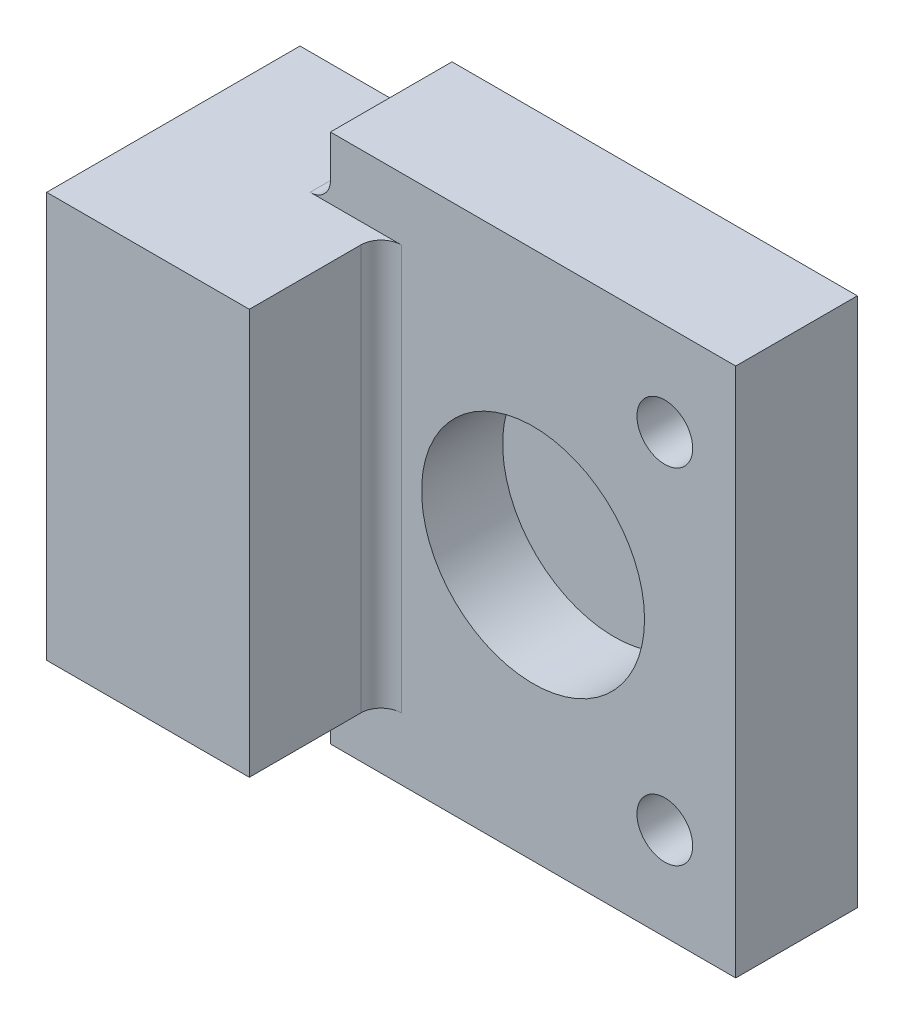
ISO-10303-21;
HEADER;
FILE_DESCRIPTION(('STEP AP214'),'2;1');
FILE_NAME('part.step','',(''),(''),'','','');
FILE_SCHEMA(('AUTOMOTIVE_DESIGN { 1 0 10303 214 1 1 1 1 }'));
ENDSEC;
DATA;
#1=APPLICATION_CONTEXT('core data for automotive mechanical design processes');
#2=APPLICATION_PROTOCOL_DEFINITION('international standard','automotive_design',2000,#1);
#3=PRODUCT_CONTEXT('',#1,'mechanical');
#4=PRODUCT('Part','Part','',(#3));
#5=PRODUCT_RELATED_PRODUCT_CATEGORY('part','',(#4));
#6=PRODUCT_DEFINITION_FORMATION('','',#4);
#7=PRODUCT_DEFINITION_CONTEXT('part definition',#1,'design');
#8=PRODUCT_DEFINITION('design','',#6,#7);
#9=PRODUCT_DEFINITION_SHAPE('','',#8);
#10=(LENGTH_UNIT() NAMED_UNIT(*) SI_UNIT(.MILLI.,.METRE.));
#11=(NAMED_UNIT(*) PLANE_ANGLE_UNIT() SI_UNIT($,.RADIAN.));
#12=(NAMED_UNIT(*) SI_UNIT($,.STERADIAN.) SOLID_ANGLE_UNIT());
#13=UNCERTAINTY_MEASURE_WITH_UNIT(LENGTH_MEASURE(1.E-05),#10,'distance_accuracy_value','');
#14=(GEOMETRIC_REPRESENTATION_CONTEXT(3) GLOBAL_UNCERTAINTY_ASSIGNED_CONTEXT((#13)) GLOBAL_UNIT_ASSIGNED_CONTEXT((#10,
#11,#12)) REPRESENTATION_CONTEXT('',''));
#15=CARTESIAN_POINT('',(0.,0.,0.));
#16=DIRECTION('',(0.,0.,1.));
#17=DIRECTION('',(1.,0.,0.));
#18=AXIS2_PLACEMENT_3D('',#15,#16,#17);
#19=CARTESIAN_POINT('',(0.,0.,12.));
#20=DIRECTION('',(0.,0.,-1.));
#21=DIRECTION('',(-1.,0.,0.));
#22=AXIS2_PLACEMENT_3D('',#19,#20,#21);
#23=PLANE('',#22);
#24=CARTESIAN_POINT('',(13.,-16.9975,12.));
#25=DIRECTION('',(0.,0.,1.));
#26=DIRECTION('',(1.,0.,0.));
#27=AXIS2_PLACEMENT_3D('',#24,#25,#26);
#28=CIRCLE('',#27,2.75);
#29=CARTESIAN_POINT('',(15.75,-16.9975,12.));
#30=VERTEX_POINT('',#29);
#31=EDGE_CURVE('E169',#30,#30,#28,.T.);
#32=ORIENTED_EDGE('',*,*,#31,.F.);
#33=EDGE_LOOP('',(#32));
#34=FACE_BOUND('',#33,.T.);
#35=CARTESIAN_POINT('',(13.,16.9975,12.));
#36=DIRECTION('',(0.,0.,1.));
#37=DIRECTION('',(1.,0.,0.));
#38=AXIS2_PLACEMENT_3D('',#35,#36,#37);
#39=CIRCLE('',#38,2.75);
#40=CARTESIAN_POINT('',(15.75,16.9975,12.));
#41=VERTEX_POINT('',#40);
#42=EDGE_CURVE('E175',#41,#41,#39,.T.);
#43=ORIENTED_EDGE('',*,*,#42,.F.);
#44=EDGE_LOOP('',(#43));
#45=FACE_BOUND('',#44,.T.);
#46=CARTESIAN_POINT('',(0.,0.,12.));
#47=DIRECTION('',(0.,0.,1.));
#48=DIRECTION('',(1.,0.,0.));
#49=AXIS2_PLACEMENT_3D('',#46,#47,#48);
#50=CIRCLE('',#49,11.);
#51=CARTESIAN_POINT('',(11.,0.,12.));
#52=VERTEX_POINT('',#51);
#53=EDGE_CURVE('E162',#52,#52,#50,.T.);
#54=ORIENTED_EDGE('',*,*,#53,.F.);
#55=EDGE_LOOP('',(#54));
#56=FACE_BOUND('',#55,.T.);
#57=DIRECTION('',(-1.,0.,0.));
#58=VECTOR('',#57,1.);
#59=CARTESIAN_POINT('',(0.,20.,12.));
#60=LINE('',#59,#58);
#61=CARTESIAN_POINT('',(-13.,20.,12.));
#62=VERTEX_POINT('',#61);
#63=CARTESIAN_POINT('',(-22.,20.,12.));
#64=VERTEX_POINT('',#63);
#65=EDGE_CURVE('E50',#62,#64,#60,.T.);
#66=ORIENTED_EDGE('',*,*,#65,.F.);
#67=DIRECTION('',(0.,1.,0.));
#68=VECTOR('',#67,1.);
#69=CARTESIAN_POINT('',(-13.,-20.,12.));
#70=LINE('',#69,#68);
#71=CARTESIAN_POINT('',(-13.,-20.,12.));
#72=VERTEX_POINT('',#71);
#73=EDGE_CURVE('E231',#62,#72,#70,.F.);
#74=ORIENTED_EDGE('',*,*,#73,.T.);
#75=DIRECTION('',(1.,0.,0.));
#76=VECTOR('',#75,1.);
#77=CARTESIAN_POINT('',(0.,-20.,12.));
#78=LINE('',#77,#76);
#79=CARTESIAN_POINT('',(-22.,-20.,12.));
#80=VERTEX_POINT('',#79);
#81=EDGE_CURVE('E57',#80,#72,#78,.T.);
#82=ORIENTED_EDGE('',*,*,#81,.F.);
#83=CARTESIAN_POINT('',(-22.,-22.,12.));
#84=DIRECTION('',(0.,0.,-1.));
#85=DIRECTION('',(-1.,0.,0.));
#86=AXIS2_PLACEMENT_3D('',#83,#84,#85);
#87=CIRCLE('',#86,2.);
#88=CARTESIAN_POINT('',(-20.,-22.,12.));
#89=VERTEX_POINT('',#88);
#90=EDGE_CURVE('E225',#80,#89,#87,.T.);
#91=ORIENTED_EDGE('',*,*,#90,.T.);
#92=DIRECTION('',(0.,-1.,0.));
#93=VECTOR('',#92,1.);
#94=CARTESIAN_POINT('',(-20.,26.15,12.));
#95=LINE('',#94,#93);
#96=CARTESIAN_POINT('',(-20.,-26.15,12.));
#97=VERTEX_POINT('',#96);
#98=EDGE_CURVE('E185',#89,#97,#95,.T.);
#99=ORIENTED_EDGE('',*,*,#98,.T.);
#100=DIRECTION('',(1.,0.,0.));
#101=VECTOR('',#100,1.);
#102=CARTESIAN_POINT('',(20.,-26.15,12.));
#103=LINE('',#102,#101);
#104=CARTESIAN_POINT('',(20.,-26.15,12.));
#105=VERTEX_POINT('',#104);
#106=EDGE_CURVE('E184',#97,#105,#103,.T.);
#107=ORIENTED_EDGE('',*,*,#106,.T.);
#108=DIRECTION('',(0.,1.,0.));
#109=VECTOR('',#108,1.);
#110=CARTESIAN_POINT('',(20.,26.15,12.));
#111=LINE('',#110,#109);
#112=CARTESIAN_POINT('',(20.,26.15,12.));
#113=VERTEX_POINT('',#112);
#114=EDGE_CURVE('E187',#105,#113,#111,.T.);
#115=ORIENTED_EDGE('',*,*,#114,.T.);
#116=DIRECTION('',(-1.,0.,0.));
#117=VECTOR('',#116,1.);
#118=CARTESIAN_POINT('',(20.,26.15,12.));
#119=LINE('',#118,#117);
#120=CARTESIAN_POINT('',(-20.,26.15,12.));
#121=VERTEX_POINT('',#120);
#122=EDGE_CURVE('E189',#113,#121,#119,.T.);
#123=ORIENTED_EDGE('',*,*,#122,.T.);
#124=CARTESIAN_POINT('',(-20.,22.,12.));
#125=VERTEX_POINT('',#124);
#126=EDGE_CURVE('E181',#121,#125,#95,.T.);
#127=ORIENTED_EDGE('',*,*,#126,.T.);
#128=CARTESIAN_POINT('',(-22.,22.,12.));
#129=DIRECTION('',(0.,0.,-1.));
#130=DIRECTION('',(-1.,0.,0.));
#131=AXIS2_PLACEMENT_3D('',#128,#129,#130);
#132=CIRCLE('',#131,2.);
#133=EDGE_CURVE('E223',#125,#64,#132,.T.);
#134=ORIENTED_EDGE('',*,*,#133,.T.);
#135=EDGE_LOOP('',(#66,#74,#82,#91,#99,#107,#115,#123,#127,#134));
#136=FACE_BOUND('',#135,.T.);
#137=ADVANCED_FACE('F35',(#34,#45,#56,#136),#23,.F.);
#138=CARTESIAN_POINT('',(-20.,26.15,12.));
#139=DIRECTION('',(1.,0.,0.));
#140=DIRECTION('',(0.,1.,0.));
#141=AXIS2_PLACEMENT_3D('',#138,#139,#140);
#142=PLANE('',#141);
#143=ORIENTED_EDGE('',*,*,#98,.F.);
#144=DIRECTION('',(0.,0.,1.));
#145=VECTOR('',#144,1.);
#146=CARTESIAN_POINT('',(-20.,-22.,0.));
#147=LINE('',#146,#145);
#148=CARTESIAN_POINT('',(-20.,-22.,0.));
#149=VERTEX_POINT('',#148);
#150=EDGE_CURVE('E219',#89,#149,#147,.F.);
#151=ORIENTED_EDGE('',*,*,#150,.T.);
#152=DIRECTION('',(0.,-1.,0.));
#153=VECTOR('',#152,1.);
#154=CARTESIAN_POINT('',(-20.,26.15,0.));
#155=LINE('',#154,#153);
#156=CARTESIAN_POINT('',(-20.,-26.15,0.));
#157=VERTEX_POINT('',#156);
#158=EDGE_CURVE('E178',#149,#157,#155,.T.);
#159=ORIENTED_EDGE('',*,*,#158,.T.);
#160=DIRECTION('',(0.,0.,-1.));
#161=VECTOR('',#160,1.);
#162=CARTESIAN_POINT('',(-20.,-26.15,12.));
#163=LINE('',#162,#161);
#164=EDGE_CURVE('E209',#97,#157,#163,.T.);
#165=ORIENTED_EDGE('',*,*,#164,.F.);
#166=EDGE_LOOP('',(#143,#151,#159,#165));
#167=FACE_BOUND('',#166,.T.);
#168=ADVANCED_FACE('F247',(#167),#142,.F.);
#169=CARTESIAN_POINT('',(-20.,26.15,0.));
#170=VERTEX_POINT('',#169);
#171=CARTESIAN_POINT('',(-20.,22.,0.));
#172=VERTEX_POINT('',#171);
#173=EDGE_CURVE('E192',#170,#172,#155,.T.);
#174=ORIENTED_EDGE('',*,*,#173,.T.);
#175=DIRECTION('',(0.,0.,-1.));
#176=VECTOR('',#175,1.);
#177=CARTESIAN_POINT('',(-20.,22.,12.));
#178=LINE('',#177,#176);
#179=EDGE_CURVE('E215',#172,#125,#178,.F.);
#180=ORIENTED_EDGE('',*,*,#179,.T.);
#181=ORIENTED_EDGE('',*,*,#126,.F.);
#182=DIRECTION('',(0.,0.,-1.));
#183=VECTOR('',#182,1.);
#184=CARTESIAN_POINT('',(-20.,26.15,12.));
#185=LINE('',#184,#183);
#186=EDGE_CURVE('E191',#121,#170,#185,.T.);
#187=ORIENTED_EDGE('',*,*,#186,.T.);
#188=EDGE_LOOP('',(#174,#180,#181,#187));
#189=FACE_BOUND('',#188,.T.);
#190=ADVANCED_FACE('F267',(#189),#142,.F.);
#191=CARTESIAN_POINT('',(0.,0.,0.));
#192=DIRECTION('',(0.,0.,-1.));
#193=DIRECTION('',(-1.,0.,0.));
#194=AXIS2_PLACEMENT_3D('',#191,#192,#193);
#195=PLANE('',#194);
#196=DIRECTION('',(1.,0.,0.));
#197=VECTOR('',#196,1.);
#198=CARTESIAN_POINT('',(-35.,20.,0.));
#199=LINE('',#198,#197);
#200=CARTESIAN_POINT('',(-35.,20.,0.));
#201=VERTEX_POINT('',#200);
#202=CARTESIAN_POINT('',(-22.,20.,0.));
#203=VERTEX_POINT('',#202);
#204=EDGE_CURVE('E273',#201,#203,#199,.T.);
#205=ORIENTED_EDGE('',*,*,#204,.T.);
#206=CARTESIAN_POINT('',(-22.,22.,0.));
#207=DIRECTION('',(0.,0.,-1.));
#208=DIRECTION('',(-1.,0.,0.));
#209=AXIS2_PLACEMENT_3D('',#206,#207,#208);
#210=CIRCLE('',#209,2.);
#211=EDGE_CURVE('E221',#203,#172,#210,.F.);
#212=ORIENTED_EDGE('',*,*,#211,.T.);
#213=ORIENTED_EDGE('',*,*,#173,.F.);
#214=DIRECTION('',(-1.,0.,0.));
#215=VECTOR('',#214,1.);
#216=CARTESIAN_POINT('',(20.,26.15,0.));
#217=LINE('',#216,#215);
#218=CARTESIAN_POINT('',(20.,26.15,0.));
#219=VERTEX_POINT('',#218);
#220=EDGE_CURVE('E199',#219,#170,#217,.T.);
#221=ORIENTED_EDGE('',*,*,#220,.F.);
#222=DIRECTION('',(0.,1.,0.));
#223=VECTOR('',#222,1.);
#224=CARTESIAN_POINT('',(20.,26.15,0.));
#225=LINE('',#224,#223);
#226=CARTESIAN_POINT('',(20.,-26.15,0.));
#227=VERTEX_POINT('',#226);
#228=EDGE_CURVE('E197',#227,#219,#225,.T.);
#229=ORIENTED_EDGE('',*,*,#228,.F.);
#230=DIRECTION('',(1.,0.,0.));
#231=VECTOR('',#230,1.);
#232=CARTESIAN_POINT('',(20.,-26.15,0.));
#233=LINE('',#232,#231);
#234=EDGE_CURVE('E195',#157,#227,#233,.T.);
#235=ORIENTED_EDGE('',*,*,#234,.F.);
#236=ORIENTED_EDGE('',*,*,#158,.F.);
#237=CARTESIAN_POINT('',(-22.,-22.,0.));
#238=DIRECTION('',(0.,0.,-1.));
#239=DIRECTION('',(-1.,0.,0.));
#240=AXIS2_PLACEMENT_3D('',#237,#238,#239);
#241=CIRCLE('',#240,2.);
#242=CARTESIAN_POINT('',(-22.,-20.,0.));
#243=VERTEX_POINT('',#242);
#244=EDGE_CURVE('E154',#149,#243,#241,.F.);
#245=ORIENTED_EDGE('',*,*,#244,.T.);
#246=DIRECTION('',(1.,0.,0.));
#247=VECTOR('',#246,1.);
#248=CARTESIAN_POINT('',(-35.,-20.,0.));
#249=LINE('',#248,#247);
#250=CARTESIAN_POINT('',(-35.,-20.,0.));
#251=VERTEX_POINT('',#250);
#252=EDGE_CURVE('E132',#251,#243,#249,.T.);
#253=ORIENTED_EDGE('',*,*,#252,.F.);
#254=DIRECTION('',(0.,-1.,0.));
#255=VECTOR('',#254,1.);
#256=CARTESIAN_POINT('',(-35.,20.,0.));
#257=LINE('',#256,#255);
#258=EDGE_CURVE('E139',#201,#251,#257,.T.);
#259=ORIENTED_EDGE('',*,*,#258,.F.);
#260=EDGE_LOOP('',(#205,#212,#213,#221,#229,#235,#236,#245,#253,#259));
#261=FACE_BOUND('',#260,.T.);
#262=CARTESIAN_POINT('',(13.,16.9975,0.));
#263=DIRECTION('',(0.,0.,1.));
#264=DIRECTION('',(1.,0.,0.));
#265=AXIS2_PLACEMENT_3D('',#262,#263,#264);
#266=CIRCLE('',#265,2.75);
#267=CARTESIAN_POINT('',(15.75,16.9975,0.));
#268=VERTEX_POINT('',#267);
#269=EDGE_CURVE('E172',#268,#268,#266,.T.);
#270=ORIENTED_EDGE('',*,*,#269,.T.);
#271=EDGE_LOOP('',(#270));
#272=FACE_BOUND('',#271,.T.);
#273=CARTESIAN_POINT('',(13.,-16.9975,0.));
#274=DIRECTION('',(0.,0.,1.));
#275=DIRECTION('',(1.,0.,0.));
#276=AXIS2_PLACEMENT_3D('',#273,#274,#275);
#277=CIRCLE('',#276,2.75);
#278=CARTESIAN_POINT('',(15.75,-16.9975,0.));
#279=VERTEX_POINT('',#278);
#280=EDGE_CURVE('E166',#279,#279,#277,.T.);
#281=ORIENTED_EDGE('',*,*,#280,.T.);
#282=EDGE_LOOP('',(#281));
#283=FACE_BOUND('',#282,.T.);
#284=ADVANCED_FACE('F150',(#261,#272,#283),#195,.T.);
#285=CARTESIAN_POINT('',(20.,-26.15,12.));
#286=DIRECTION('',(0.,1.,0.));
#287=DIRECTION('',(0.,0.,1.));
#288=AXIS2_PLACEMENT_3D('',#285,#286,#287);
#289=PLANE('',#288);
#290=ORIENTED_EDGE('',*,*,#234,.T.);
#291=DIRECTION('',(0.,0.,-1.));
#292=VECTOR('',#291,1.);
#293=CARTESIAN_POINT('',(20.,-26.15,12.));
#294=LINE('',#293,#292);
#295=EDGE_CURVE('E206',#105,#227,#294,.T.);
#296=ORIENTED_EDGE('',*,*,#295,.F.);
#297=ORIENTED_EDGE('',*,*,#106,.F.);
#298=ORIENTED_EDGE('',*,*,#164,.T.);
#299=EDGE_LOOP('',(#290,#296,#297,#298));
#300=FACE_BOUND('',#299,.T.);
#301=ADVANCED_FACE('F255',(#300),#289,.F.);
#302=CARTESIAN_POINT('',(20.,26.15,12.));
#303=DIRECTION('',(-1.,0.,0.));
#304=DIRECTION('',(0.,-1.,0.));
#305=AXIS2_PLACEMENT_3D('',#302,#303,#304);
#306=PLANE('',#305);
#307=ORIENTED_EDGE('',*,*,#228,.T.);
#308=DIRECTION('',(0.,0.,-1.));
#309=VECTOR('',#308,1.);
#310=CARTESIAN_POINT('',(20.,26.15,12.));
#311=LINE('',#310,#309);
#312=EDGE_CURVE('E203',#113,#219,#311,.T.);
#313=ORIENTED_EDGE('',*,*,#312,.F.);
#314=ORIENTED_EDGE('',*,*,#114,.F.);
#315=ORIENTED_EDGE('',*,*,#295,.T.);
#316=EDGE_LOOP('',(#307,#313,#314,#315));
#317=FACE_BOUND('',#316,.T.);
#318=ADVANCED_FACE('F261',(#317),#306,.F.);
#319=CARTESIAN_POINT('',(20.,26.15,12.));
#320=DIRECTION('',(0.,-1.,0.));
#321=DIRECTION('',(1.,0.,0.));
#322=AXIS2_PLACEMENT_3D('',#319,#320,#321);
#323=PLANE('',#322);
#324=ORIENTED_EDGE('',*,*,#220,.T.);
#325=ORIENTED_EDGE('',*,*,#186,.F.);
#326=ORIENTED_EDGE('',*,*,#122,.F.);
#327=ORIENTED_EDGE('',*,*,#312,.T.);
#328=EDGE_LOOP('',(#324,#325,#326,#327));
#329=FACE_BOUND('',#328,.T.);
#330=ADVANCED_FACE('F263',(#329),#323,.F.);
#331=CARTESIAN_POINT('',(13.,16.9975,12.));
#332=DIRECTION('',(0.,0.,-1.));
#333=DIRECTION('',(-1.,0.,0.));
#334=AXIS2_PLACEMENT_3D('',#331,#332,#333);
#335=CYLINDRICAL_SURFACE('',#334,2.75);
#336=ORIENTED_EDGE('',*,*,#42,.T.);
#337=EDGE_LOOP('',(#336));
#338=FACE_BOUND('',#337,.T.);
#339=ORIENTED_EDGE('',*,*,#269,.F.);
#340=EDGE_LOOP('',(#339));
#341=FACE_BOUND('',#340,.T.);
#342=ADVANCED_FACE('F323',(#338,#341),#335,.F.);
#343=CARTESIAN_POINT('',(13.,-16.9975,12.));
#344=DIRECTION('',(0.,0.,-1.));
#345=DIRECTION('',(-1.,0.,0.));
#346=AXIS2_PLACEMENT_3D('',#343,#344,#345);
#347=CYLINDRICAL_SURFACE('',#346,2.75);
#348=ORIENTED_EDGE('',*,*,#31,.T.);
#349=EDGE_LOOP('',(#348));
#350=FACE_BOUND('',#349,.T.);
#351=ORIENTED_EDGE('',*,*,#280,.F.);
#352=EDGE_LOOP('',(#351));
#353=FACE_BOUND('',#352,.T.);
#354=ADVANCED_FACE('F433',(#350,#353),#347,.F.);
#355=CARTESIAN_POINT('',(0.,0.,4.));
#356=DIRECTION('',(0.,0.,1.));
#357=DIRECTION('',(1.,0.,0.));
#358=AXIS2_PLACEMENT_3D('',#355,#356,#357);
#359=CYLINDRICAL_SURFACE('',#358,11.);
#360=CARTESIAN_POINT('',(0.,0.,4.));
#361=DIRECTION('',(0.,0.,1.));
#362=DIRECTION('',(1.,0.,0.));
#363=AXIS2_PLACEMENT_3D('',#360,#361,#362);
#364=CIRCLE('',#363,11.);
#365=CARTESIAN_POINT('',(11.,0.,4.));
#366=VERTEX_POINT('',#365);
#367=EDGE_CURVE('E163',#366,#366,#364,.T.);
#368=ORIENTED_EDGE('',*,*,#367,.F.);
#369=EDGE_LOOP('',(#368));
#370=FACE_BOUND('',#369,.T.);
#371=ORIENTED_EDGE('',*,*,#53,.T.);
#372=EDGE_LOOP('',(#371));
#373=FACE_BOUND('',#372,.T.);
#374=ADVANCED_FACE('F425',(#370,#373),#359,.F.);
#375=CARTESIAN_POINT('',(0.,0.,4.));
#376=DIRECTION('',(0.,0.,1.));
#377=DIRECTION('',(1.,0.,0.));
#378=AXIS2_PLACEMENT_3D('',#375,#376,#377);
#379=PLANE('',#378);
#380=ORIENTED_EDGE('',*,*,#367,.T.);
#381=EDGE_LOOP('',(#380));
#382=FACE_BOUND('',#381,.T.);
#383=ADVANCED_FACE('F307',(#382),#379,.T.);
#384=CARTESIAN_POINT('',(-15.,0.,0.));
#385=DIRECTION('',(-1.,0.,0.));
#386=DIRECTION('',(0.,-1.,0.));
#387=AXIS2_PLACEMENT_3D('',#384,#385,#386);
#388=PLANE('',#387);
#389=DIRECTION('',(0.,0.,1.));
#390=VECTOR('',#389,1.);
#391=CARTESIAN_POINT('',(-15.,-20.,0.));
#392=LINE('',#391,#390);
#393=CARTESIAN_POINT('',(-15.,-20.,14.));
#394=VERTEX_POINT('',#393);
#395=CARTESIAN_POINT('',(-15.,-20.,25.));
#396=VERTEX_POINT('',#395);
#397=EDGE_CURVE('E280',#394,#396,#392,.T.);
#398=ORIENTED_EDGE('',*,*,#397,.F.);
#399=DIRECTION('',(0.,1.,0.));
#400=VECTOR('',#399,1.);
#401=CARTESIAN_POINT('',(-15.,20.,14.));
#402=LINE('',#401,#400);
#403=CARTESIAN_POINT('',(-15.,20.,14.));
#404=VERTEX_POINT('',#403);
#405=EDGE_CURVE('E228',#394,#404,#402,.T.);
#406=ORIENTED_EDGE('',*,*,#405,.T.);
#407=DIRECTION('',(0.,0.,-1.));
#408=VECTOR('',#407,1.);
#409=CARTESIAN_POINT('',(-15.,20.,0.));
#410=LINE('',#409,#408);
#411=CARTESIAN_POINT('',(-15.,20.,25.));
#412=VERTEX_POINT('',#411);
#413=EDGE_CURVE('E148',#412,#404,#410,.T.);
#414=ORIENTED_EDGE('',*,*,#413,.F.);
#415=DIRECTION('',(0.,1.,0.));
#416=VECTOR('',#415,1.);
#417=CARTESIAN_POINT('',(-15.,20.,25.));
#418=LINE('',#417,#416);
#419=EDGE_CURVE('E278',#396,#412,#418,.T.);
#420=ORIENTED_EDGE('',*,*,#419,.F.);
#421=EDGE_LOOP('',(#398,#406,#414,#420));
#422=FACE_BOUND('',#421,.T.);
#423=ADVANCED_FACE('F299',(#422),#388,.F.);
#424=CARTESIAN_POINT('',(-35.,-20.,0.));
#425=DIRECTION('',(0.,1.,0.));
#426=DIRECTION('',(-1.,0.,0.));
#427=AXIS2_PLACEMENT_3D('',#424,#425,#426);
#428=PLANE('',#427);
#429=CARTESIAN_POINT('',(-25.,-20.,15.));
#430=DIRECTION('',(0.,-1.,0.));
#431=DIRECTION('',(1.,0.,0.));
#432=AXIS2_PLACEMENT_3D('',#429,#430,#431);
#433=CIRCLE('',#432,4.);
#434=CARTESIAN_POINT('',(-21.,-20.,15.));
#435=VERTEX_POINT('',#434);
#436=EDGE_CURVE('E284',#435,#435,#433,.T.);
#437=ORIENTED_EDGE('',*,*,#436,.F.);
#438=EDGE_LOOP('',(#437));
#439=FACE_BOUND('',#438,.T.);
#440=ORIENTED_EDGE('',*,*,#252,.T.);
#441=DIRECTION('',(0.,0.,1.));
#442=VECTOR('',#441,1.);
#443=CARTESIAN_POINT('',(-22.,-20.,12.));
#444=LINE('',#443,#442);
#445=EDGE_CURVE('E217',#243,#80,#444,.T.);
#446=ORIENTED_EDGE('',*,*,#445,.T.);
#447=ORIENTED_EDGE('',*,*,#81,.T.);
#448=CARTESIAN_POINT('',(-13.,-20.,14.));
#449=DIRECTION('',(0.,1.,0.));
#450=DIRECTION('',(-1.,0.,0.));
#451=AXIS2_PLACEMENT_3D('',#448,#449,#450);
#452=CIRCLE('',#451,2.);
#453=EDGE_CURVE('E11',#72,#394,#452,.T.);
#454=ORIENTED_EDGE('',*,*,#453,.T.);
#455=ORIENTED_EDGE('',*,*,#397,.T.);
#456=DIRECTION('',(1.,0.,0.));
#457=VECTOR('',#456,1.);
#458=CARTESIAN_POINT('',(-35.,-20.,25.));
#459=LINE('',#458,#457);
#460=CARTESIAN_POINT('',(-35.,-20.,25.));
#461=VERTEX_POINT('',#460);
#462=EDGE_CURVE('E135',#461,#396,#459,.T.);
#463=ORIENTED_EDGE('',*,*,#462,.F.);
#464=DIRECTION('',(0.,0.,1.));
#465=VECTOR('',#464,1.);
#466=CARTESIAN_POINT('',(-35.,-20.,0.));
#467=LINE('',#466,#465);
#468=EDGE_CURVE('E128',#251,#461,#467,.T.);
#469=ORIENTED_EDGE('',*,*,#468,.F.);
#470=EDGE_LOOP('',(#440,#446,#447,#454,#455,#463,#469));
#471=FACE_BOUND('',#470,.T.);
#472=ADVANCED_FACE('F130',(#439,#471),#428,.F.);
#473=CARTESIAN_POINT('',(-35.,20.,0.));
#474=DIRECTION('',(0.,-1.,0.));
#475=DIRECTION('',(1.,0.,0.));
#476=AXIS2_PLACEMENT_3D('',#473,#474,#475);
#477=PLANE('',#476);
#478=ORIENTED_EDGE('',*,*,#65,.T.);
#479=DIRECTION('',(0.,0.,-1.));
#480=VECTOR('',#479,1.);
#481=CARTESIAN_POINT('',(-22.,20.,0.));
#482=LINE('',#481,#480);
#483=EDGE_CURVE('E212',#64,#203,#482,.T.);
#484=ORIENTED_EDGE('',*,*,#483,.T.);
#485=ORIENTED_EDGE('',*,*,#204,.F.);
#486=DIRECTION('',(0.,0.,-1.));
#487=VECTOR('',#486,1.);
#488=CARTESIAN_POINT('',(-35.,20.,0.));
#489=LINE('',#488,#487);
#490=CARTESIAN_POINT('',(-35.,20.,25.));
#491=VERTEX_POINT('',#490);
#492=EDGE_CURVE('E144',#491,#201,#489,.T.);
#493=ORIENTED_EDGE('',*,*,#492,.F.);
#494=DIRECTION('',(1.,0.,0.));
#495=VECTOR('',#494,1.);
#496=CARTESIAN_POINT('',(-35.,20.,25.));
#497=LINE('',#496,#495);
#498=EDGE_CURVE('E157',#491,#412,#497,.T.);
#499=ORIENTED_EDGE('',*,*,#498,.T.);
#500=ORIENTED_EDGE('',*,*,#413,.T.);
#501=CARTESIAN_POINT('',(-13.,20.,14.));
#502=DIRECTION('',(0.,-1.,0.));
#503=DIRECTION('',(1.,0.,0.));
#504=AXIS2_PLACEMENT_3D('',#501,#502,#503);
#505=CIRCLE('',#504,2.);
#506=EDGE_CURVE('E43',#404,#62,#505,.T.);
#507=ORIENTED_EDGE('',*,*,#506,.T.);
#508=EDGE_LOOP('',(#478,#484,#485,#493,#499,#500,#507));
#509=FACE_BOUND('',#508,.T.);
#510=ADVANCED_FACE('F235',(#509),#477,.F.);
#511=CARTESIAN_POINT('',(-35.,20.,25.));
#512=DIRECTION('',(0.,0.,-1.));
#513=DIRECTION('',(-1.,0.,0.));
#514=AXIS2_PLACEMENT_3D('',#511,#512,#513);
#515=PLANE('',#514);
#516=ORIENTED_EDGE('',*,*,#419,.T.);
#517=ORIENTED_EDGE('',*,*,#498,.F.);
#518=DIRECTION('',(0.,1.,0.));
#519=VECTOR('',#518,1.);
#520=CARTESIAN_POINT('',(-35.,20.,25.));
#521=LINE('',#520,#519);
#522=EDGE_CURVE('E138',#461,#491,#521,.T.);
#523=ORIENTED_EDGE('',*,*,#522,.F.);
#524=ORIENTED_EDGE('',*,*,#462,.T.);
#525=EDGE_LOOP('',(#516,#517,#523,#524));
#526=FACE_BOUND('',#525,.T.);
#527=ADVANCED_FACE('F305',(#526),#515,.F.);
#528=CARTESIAN_POINT('',(-35.,0.,0.));
#529=DIRECTION('',(-1.,0.,0.));
#530=DIRECTION('',(0.,-1.,0.));
#531=AXIS2_PLACEMENT_3D('',#528,#529,#530);
#532=PLANE('',#531);
#533=ORIENTED_EDGE('',*,*,#258,.T.);
#534=ORIENTED_EDGE('',*,*,#468,.T.);
#535=ORIENTED_EDGE('',*,*,#522,.T.);
#536=ORIENTED_EDGE('',*,*,#492,.T.);
#537=EDGE_LOOP('',(#533,#534,#535,#536));
#538=FACE_BOUND('',#537,.T.);
#539=ADVANCED_FACE('F142',(#538),#532,.T.);
#540=CARTESIAN_POINT('',(-22.,22.,0.));
#541=DIRECTION('',(0.,0.,1.));
#542=DIRECTION('',(1.,0.,0.));
#543=AXIS2_PLACEMENT_3D('',#540,#541,#542);
#544=CYLINDRICAL_SURFACE('',#543,2.);
#545=ORIENTED_EDGE('',*,*,#133,.F.);
#546=ORIENTED_EDGE('',*,*,#179,.F.);
#547=ORIENTED_EDGE('',*,*,#211,.F.);
#548=ORIENTED_EDGE('',*,*,#483,.F.);
#549=EDGE_LOOP('',(#545,#546,#547,#548));
#550=FACE_BOUND('',#549,.T.);
#551=ADVANCED_FACE('F272',(#550),#544,.F.);
#552=CARTESIAN_POINT('',(-22.,-22.,0.));
#553=DIRECTION('',(0.,0.,-1.));
#554=DIRECTION('',(-1.,0.,0.));
#555=AXIS2_PLACEMENT_3D('',#552,#553,#554);
#556=CYLINDRICAL_SURFACE('',#555,2.);
#557=ORIENTED_EDGE('',*,*,#244,.F.);
#558=ORIENTED_EDGE('',*,*,#150,.F.);
#559=ORIENTED_EDGE('',*,*,#90,.F.);
#560=ORIENTED_EDGE('',*,*,#445,.F.);
#561=EDGE_LOOP('',(#557,#558,#559,#560));
#562=FACE_BOUND('',#561,.T.);
#563=ADVANCED_FACE('F245',(#562),#556,.F.);
#564=CARTESIAN_POINT('',(-13.,0.,14.));
#565=DIRECTION('',(0.,-1.,0.));
#566=DIRECTION('',(1.,0.,0.));
#567=AXIS2_PLACEMENT_3D('',#564,#565,#566);
#568=CYLINDRICAL_SURFACE('',#567,2.);
#569=ORIENTED_EDGE('',*,*,#453,.F.);
#570=ORIENTED_EDGE('',*,*,#73,.F.);
#571=ORIENTED_EDGE('',*,*,#506,.F.);
#572=ORIENTED_EDGE('',*,*,#405,.F.);
#573=EDGE_LOOP('',(#569,#570,#571,#572));
#574=FACE_BOUND('',#573,.T.);
#575=ADVANCED_FACE('F37',(#574),#568,.F.);
#576=CARTESIAN_POINT('',(-25.,15.,15.));
#577=DIRECTION('',(0.,-1.,0.));
#578=DIRECTION('',(1.,0.,0.));
#579=AXIS2_PLACEMENT_3D('',#576,#577,#578);
#580=CYLINDRICAL_SURFACE('',#579,4.);
#581=CARTESIAN_POINT('',(-25.,15.,15.));
#582=DIRECTION('',(0.,-1.,0.));
#583=DIRECTION('',(1.,0.,0.));
#584=AXIS2_PLACEMENT_3D('',#581,#582,#583);
#585=CIRCLE('',#584,4.);
#586=CARTESIAN_POINT('',(-21.,15.,15.));
#587=VERTEX_POINT('',#586);
#588=EDGE_CURVE('E281',#587,#587,#585,.T.);
#589=ORIENTED_EDGE('',*,*,#588,.F.);
#590=EDGE_LOOP('',(#589));
#591=FACE_BOUND('',#590,.T.);
#592=ORIENTED_EDGE('',*,*,#436,.T.);
#593=EDGE_LOOP('',(#592));
#594=FACE_BOUND('',#593,.T.);
#595=ADVANCED_FACE('F292',(#591,#594),#580,.F.);
#596=CARTESIAN_POINT('',(-25.,15.,15.));
#597=DIRECTION('',(0.,-1.,0.));
#598=DIRECTION('',(1.,0.,0.));
#599=AXIS2_PLACEMENT_3D('',#596,#597,#598);
#600=PLANE('',#599);
#601=ORIENTED_EDGE('',*,*,#588,.T.);
#602=EDGE_LOOP('',(#601));
#603=FACE_BOUND('',#602,.T.);
#604=ADVANCED_FACE('F290',(#603),#600,.T.);
#605=CLOSED_SHELL('',(#137,#168,#190,#284,#301,#318,#330,#342,#354,#374,#383,#423,#472,#510,
#527,#539,#551,#563,#575,#595,#604));
#606=MANIFOLD_SOLID_BREP('B2',#605);
#607=ADVANCED_BREP_SHAPE_REPRESENTATION('',(#18,#606),#14);
#608=SHAPE_DEFINITION_REPRESENTATION(#9,#607);
ENDSEC;
END-ISO-10303-21;
